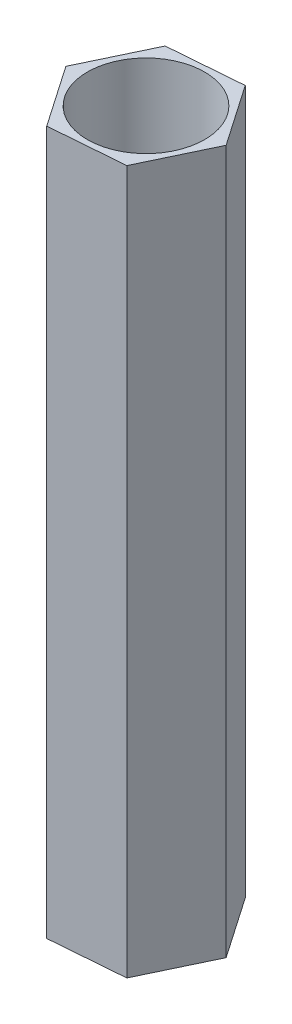
ISO-10303-21;
HEADER;
FILE_DESCRIPTION(('STEP AP214'),'2;1');
FILE_NAME('part.step','',(''),(''),'','','');
FILE_SCHEMA(('AUTOMOTIVE_DESIGN { 1 0 10303 214 1 1 1 1 }'));
ENDSEC;
DATA;
#1=APPLICATION_CONTEXT('core data for automotive mechanical design processes');
#2=APPLICATION_PROTOCOL_DEFINITION('international standard','automotive_design',2000,#1);
#3=PRODUCT_CONTEXT('',#1,'mechanical');
#4=PRODUCT('Part','Part','',(#3));
#5=PRODUCT_RELATED_PRODUCT_CATEGORY('part','',(#4));
#6=PRODUCT_DEFINITION_FORMATION('','',#4);
#7=PRODUCT_DEFINITION_CONTEXT('part definition',#1,'design');
#8=PRODUCT_DEFINITION('design','',#6,#7);
#9=PRODUCT_DEFINITION_SHAPE('','',#8);
#10=(LENGTH_UNIT() NAMED_UNIT(*) SI_UNIT(.MILLI.,.METRE.));
#11=(NAMED_UNIT(*) PLANE_ANGLE_UNIT() SI_UNIT($,.RADIAN.));
#12=(NAMED_UNIT(*) SI_UNIT($,.STERADIAN.) SOLID_ANGLE_UNIT());
#13=UNCERTAINTY_MEASURE_WITH_UNIT(LENGTH_MEASURE(1.E-05),#10,'distance_accuracy_value','');
#14=(GEOMETRIC_REPRESENTATION_CONTEXT(3) GLOBAL_UNCERTAINTY_ASSIGNED_CONTEXT((#13)) GLOBAL_UNIT_ASSIGNED_CONTEXT((#10,
#11,#12)) REPRESENTATION_CONTEXT('',''));
#15=CARTESIAN_POINT('',(0.,0.,0.));
#16=DIRECTION('',(0.,0.,1.));
#17=DIRECTION('',(1.,0.,0.));
#18=AXIS2_PLACEMENT_3D('',#15,#16,#17);
#19=CARTESIAN_POINT('',(0.,18.,0.));
#20=DIRECTION('',(0.,1.,0.));
#21=DIRECTION('',(0.,0.,1.));
#22=AXIS2_PLACEMENT_3D('',#19,#20,#21);
#23=PLANE('',#22);
#24=DIRECTION('',(0.996869686812316,0.,-0.0790621749935751));
#25=VECTOR('',#24,1.);
#26=CARTESIAN_POINT('',(-0.819193331606914,18.,1.7201518204655));
#27=LINE('',#26,#25);
#28=CARTESIAN_POINT('',(-0.819193331606914,18.,1.7201518204655));
#29=VERTEX_POINT('',#28);
#30=CARTESIAN_POINT('',(1.08009850908571,18.,1.56951814601515));
#31=VERTEX_POINT('',#30);
#32=EDGE_CURVE('E129',#29,#31,#27,.T.);
#33=ORIENTED_EDGE('',*,*,#32,.T.);
#34=DIRECTION('',(0.429964991383271,0.,-0.902845560538891));
#35=VECTOR('',#34,1.);
#36=CARTESIAN_POINT('',(1.08009850908571,18.,1.56951814601515));
#37=LINE('',#36,#35);
#38=CARTESIAN_POINT('',(1.89929184069263,18.,-0.150633674450351));
#39=VERTEX_POINT('',#38);
#40=EDGE_CURVE('E87',#31,#39,#37,.T.);
#41=ORIENTED_EDGE('',*,*,#40,.T.);
#42=DIRECTION('',(-0.566904695429045,0.,-0.823783385545315));
#43=VECTOR('',#42,1.);
#44=CARTESIAN_POINT('',(1.89929184069263,18.,-0.150633674450351));
#45=LINE('',#44,#43);
#46=CARTESIAN_POINT('',(0.819193331606914,18.,-1.7201518204655));
#47=VERTEX_POINT('',#46);
#48=EDGE_CURVE('E100',#39,#47,#45,.T.);
#49=ORIENTED_EDGE('',*,*,#48,.T.);
#50=DIRECTION('',(-0.996869686812316,0.,0.0790621749935752));
#51=VECTOR('',#50,1.);
#52=CARTESIAN_POINT('',(0.819193331606914,18.,-1.7201518204655));
#53=LINE('',#52,#51);
#54=CARTESIAN_POINT('',(-1.08009850908571,18.,-1.56951814601515));
#55=VERTEX_POINT('',#54);
#56=EDGE_CURVE('E94',#47,#55,#53,.T.);
#57=ORIENTED_EDGE('',*,*,#56,.T.);
#58=DIRECTION('',(-0.429964991383271,0.,0.902845560538891));
#59=VECTOR('',#58,1.);
#60=CARTESIAN_POINT('',(-1.08009850908571,18.,-1.56951814601515));
#61=LINE('',#60,#59);
#62=CARTESIAN_POINT('',(-1.89929184069263,18.,0.150633674450351));
#63=VERTEX_POINT('',#62);
#64=EDGE_CURVE('E98',#55,#63,#61,.T.);
#65=ORIENTED_EDGE('',*,*,#64,.T.);
#66=DIRECTION('',(0.566904695429045,0.,0.823783385545315));
#67=VECTOR('',#66,1.);
#68=CARTESIAN_POINT('',(-1.89929184069263,18.,0.150633674450351));
#69=LINE('',#68,#67);
#70=EDGE_CURVE('E50',#63,#29,#69,.T.);
#71=ORIENTED_EDGE('',*,*,#70,.T.);
#72=EDGE_LOOP('',(#33,#41,#49,#57,#65,#71));
#73=FACE_BOUND('',#72,.T.);
#74=CARTESIAN_POINT('',(0.,18.,0.));
#75=DIRECTION('',(0.,1.,0.));
#76=DIRECTION('',(0.,0.,1.));
#77=AXIS2_PLACEMENT_3D('',#74,#75,#76);
#78=CIRCLE('',#77,1.5);
#79=CARTESIAN_POINT('',(0.,18.,1.5));
#80=VERTEX_POINT('',#79);
#81=EDGE_CURVE('E122',#80,#80,#78,.T.);
#82=ORIENTED_EDGE('',*,*,#81,.F.);
#83=EDGE_LOOP('',(#82));
#84=FACE_BOUND('',#83,.T.);
#85=ADVANCED_FACE('F33',(#73,#84),#23,.T.);
#86=CARTESIAN_POINT('',(0.,0.,0.));
#87=DIRECTION('',(0.,1.,0.));
#88=DIRECTION('',(0.,0.,1.));
#89=AXIS2_PLACEMENT_3D('',#86,#87,#88);
#90=PLANE('',#89);
#91=DIRECTION('',(0.996869686812316,0.,-0.0790621749935751));
#92=VECTOR('',#91,1.);
#93=CARTESIAN_POINT('',(-0.819193331606914,0.,1.7201518204655));
#94=LINE('',#93,#92);
#95=CARTESIAN_POINT('',(-0.819193331606914,0.,1.7201518204655));
#96=VERTEX_POINT('',#95);
#97=CARTESIAN_POINT('',(1.08009850908571,0.,1.56951814601515));
#98=VERTEX_POINT('',#97);
#99=EDGE_CURVE('E118',#96,#98,#94,.T.);
#100=ORIENTED_EDGE('',*,*,#99,.F.);
#101=DIRECTION('',(0.566904695429045,0.,0.823783385545315));
#102=VECTOR('',#101,1.);
#103=CARTESIAN_POINT('',(-1.89929184069263,0.,0.150633674450351));
#104=LINE('',#103,#102);
#105=CARTESIAN_POINT('',(-1.89929184069263,0.,0.150633674450351));
#106=VERTEX_POINT('',#105);
#107=EDGE_CURVE('E79',#106,#96,#104,.T.);
#108=ORIENTED_EDGE('',*,*,#107,.F.);
#109=DIRECTION('',(-0.429964991383271,0.,0.902845560538891));
#110=VECTOR('',#109,1.);
#111=CARTESIAN_POINT('',(-1.08009850908571,0.,-1.56951814601515));
#112=LINE('',#111,#110);
#113=CARTESIAN_POINT('',(-1.08009850908571,0.,-1.56951814601515));
#114=VERTEX_POINT('',#113);
#115=EDGE_CURVE('E73',#114,#106,#112,.T.);
#116=ORIENTED_EDGE('',*,*,#115,.F.);
#117=DIRECTION('',(-0.996869686812316,0.,0.0790621749935752));
#118=VECTOR('',#117,1.);
#119=CARTESIAN_POINT('',(0.819193331606914,0.,-1.7201518204655));
#120=LINE('',#119,#118);
#121=CARTESIAN_POINT('',(0.819193331606914,0.,-1.7201518204655));
#122=VERTEX_POINT('',#121);
#123=EDGE_CURVE('E108',#122,#114,#120,.T.);
#124=ORIENTED_EDGE('',*,*,#123,.F.);
#125=DIRECTION('',(-0.566904695429045,0.,-0.823783385545315));
#126=VECTOR('',#125,1.);
#127=CARTESIAN_POINT('',(1.89929184069263,0.,-0.150633674450351));
#128=LINE('',#127,#126);
#129=CARTESIAN_POINT('',(1.89929184069263,0.,-0.150633674450351));
#130=VERTEX_POINT('',#129);
#131=EDGE_CURVE('E124',#130,#122,#128,.T.);
#132=ORIENTED_EDGE('',*,*,#131,.F.);
#133=DIRECTION('',(0.429964991383271,0.,-0.902845560538891));
#134=VECTOR('',#133,1.);
#135=CARTESIAN_POINT('',(1.08009850908571,0.,1.56951814601515));
#136=LINE('',#135,#134);
#137=EDGE_CURVE('E121',#98,#130,#136,.T.);
#138=ORIENTED_EDGE('',*,*,#137,.F.);
#139=EDGE_LOOP('',(#100,#108,#116,#124,#132,#138));
#140=FACE_BOUND('',#139,.T.);
#141=CARTESIAN_POINT('',(0.,0.,0.));
#142=DIRECTION('',(0.,1.,0.));
#143=DIRECTION('',(0.,0.,1.));
#144=AXIS2_PLACEMENT_3D('',#141,#142,#143);
#145=CIRCLE('',#144,1.5);
#146=CARTESIAN_POINT('',(0.,0.,1.5));
#147=VERTEX_POINT('',#146);
#148=EDGE_CURVE('E222',#147,#147,#145,.T.);
#149=ORIENTED_EDGE('',*,*,#148,.T.);
#150=EDGE_LOOP('',(#149));
#151=FACE_BOUND('',#150,.T.);
#152=ADVANCED_FACE('F138',(#140,#151),#90,.F.);
#153=CARTESIAN_POINT('',(-0.819193331606914,18.,1.7201518204655));
#154=DIRECTION('',(-0.0790621749935751,0.,-0.996869686812316));
#155=DIRECTION('',(-0.996869686812316,0.,0.0790621749935751));
#156=AXIS2_PLACEMENT_3D('',#153,#154,#155);
#157=PLANE('',#156);
#158=ORIENTED_EDGE('',*,*,#99,.T.);
#159=DIRECTION('',(0.,-1.,0.));
#160=VECTOR('',#159,1.);
#161=CARTESIAN_POINT('',(1.08009850908571,18.,1.56951814601515));
#162=LINE('',#161,#160);
#163=EDGE_CURVE('E11',#31,#98,#162,.T.);
#164=ORIENTED_EDGE('',*,*,#163,.F.);
#165=ORIENTED_EDGE('',*,*,#32,.F.);
#166=DIRECTION('',(0.,-1.,0.));
#167=VECTOR('',#166,1.);
#168=CARTESIAN_POINT('',(-0.819193331606914,18.,1.7201518204655));
#169=LINE('',#168,#167);
#170=EDGE_CURVE('E114',#29,#96,#169,.T.);
#171=ORIENTED_EDGE('',*,*,#170,.T.);
#172=EDGE_LOOP('',(#158,#164,#165,#171));
#173=FACE_BOUND('',#172,.T.);
#174=ADVANCED_FACE('F35',(#173),#157,.F.);
#175=CARTESIAN_POINT('',(1.08009850908571,18.,1.56951814601515));
#176=DIRECTION('',(-0.902845560538891,0.,-0.429964991383271));
#177=DIRECTION('',(-0.429964991383271,0.,0.902845560538891));
#178=AXIS2_PLACEMENT_3D('',#175,#176,#177);
#179=PLANE('',#178);
#180=ORIENTED_EDGE('',*,*,#137,.T.);
#181=DIRECTION('',(0.,-1.,0.));
#182=VECTOR('',#181,1.);
#183=CARTESIAN_POINT('',(1.89929184069263,18.,-0.150633674450351));
#184=LINE('',#183,#182);
#185=EDGE_CURVE('E42',#39,#130,#184,.T.);
#186=ORIENTED_EDGE('',*,*,#185,.F.);
#187=ORIENTED_EDGE('',*,*,#40,.F.);
#188=ORIENTED_EDGE('',*,*,#163,.T.);
#189=EDGE_LOOP('',(#180,#186,#187,#188));
#190=FACE_BOUND('',#189,.T.);
#191=ADVANCED_FACE('F163',(#190),#179,.F.);
#192=CARTESIAN_POINT('',(1.89929184069263,18.,-0.150633674450351));
#193=DIRECTION('',(-0.823783385545315,0.,0.566904695429045));
#194=DIRECTION('',(0.566904695429045,0.,0.823783385545315));
#195=AXIS2_PLACEMENT_3D('',#192,#193,#194);
#196=PLANE('',#195);
#197=ORIENTED_EDGE('',*,*,#131,.T.);
#198=DIRECTION('',(0.,-1.,0.));
#199=VECTOR('',#198,1.);
#200=CARTESIAN_POINT('',(0.819193331606914,18.,-1.7201518204655));
#201=LINE('',#200,#199);
#202=EDGE_CURVE('E109',#47,#122,#201,.T.);
#203=ORIENTED_EDGE('',*,*,#202,.F.);
#204=ORIENTED_EDGE('',*,*,#48,.F.);
#205=ORIENTED_EDGE('',*,*,#185,.T.);
#206=EDGE_LOOP('',(#197,#203,#204,#205));
#207=FACE_BOUND('',#206,.T.);
#208=ADVANCED_FACE('F135',(#207),#196,.F.);
#209=CARTESIAN_POINT('',(0.819193331606914,18.,-1.7201518204655));
#210=DIRECTION('',(0.0790621749935752,0.,0.996869686812316));
#211=DIRECTION('',(0.996869686812316,0.,-0.0790621749935752));
#212=AXIS2_PLACEMENT_3D('',#209,#210,#211);
#213=PLANE('',#212);
#214=ORIENTED_EDGE('',*,*,#123,.T.);
#215=DIRECTION('',(0.,-1.,0.));
#216=VECTOR('',#215,1.);
#217=CARTESIAN_POINT('',(-1.08009850908571,18.,-1.56951814601515));
#218=LINE('',#217,#216);
#219=EDGE_CURVE('E105',#55,#114,#218,.T.);
#220=ORIENTED_EDGE('',*,*,#219,.F.);
#221=ORIENTED_EDGE('',*,*,#56,.F.);
#222=ORIENTED_EDGE('',*,*,#202,.T.);
#223=EDGE_LOOP('',(#214,#220,#221,#222));
#224=FACE_BOUND('',#223,.T.);
#225=ADVANCED_FACE('F106',(#224),#213,.F.);
#226=CARTESIAN_POINT('',(-1.08009850908571,18.,-1.56951814601515));
#227=DIRECTION('',(0.902845560538891,0.,0.429964991383271));
#228=DIRECTION('',(0.429964991383271,0.,-0.902845560538891));
#229=AXIS2_PLACEMENT_3D('',#226,#227,#228);
#230=PLANE('',#229);
#231=ORIENTED_EDGE('',*,*,#115,.T.);
#232=DIRECTION('',(0.,-1.,0.));
#233=VECTOR('',#232,1.);
#234=CARTESIAN_POINT('',(-1.89929184069263,18.,0.150633674450351));
#235=LINE('',#234,#233);
#236=EDGE_CURVE('E110',#63,#106,#235,.T.);
#237=ORIENTED_EDGE('',*,*,#236,.F.);
#238=ORIENTED_EDGE('',*,*,#64,.F.);
#239=ORIENTED_EDGE('',*,*,#219,.T.);
#240=EDGE_LOOP('',(#231,#237,#238,#239));
#241=FACE_BOUND('',#240,.T.);
#242=ADVANCED_FACE('F112',(#241),#230,.F.);
#243=CARTESIAN_POINT('',(-1.89929184069263,18.,0.150633674450351));
#244=DIRECTION('',(0.823783385545315,0.,-0.566904695429045));
#245=DIRECTION('',(-0.566904695429045,0.,-0.823783385545315));
#246=AXIS2_PLACEMENT_3D('',#243,#244,#245);
#247=PLANE('',#246);
#248=ORIENTED_EDGE('',*,*,#107,.T.);
#249=ORIENTED_EDGE('',*,*,#170,.F.);
#250=ORIENTED_EDGE('',*,*,#70,.F.);
#251=ORIENTED_EDGE('',*,*,#236,.T.);
#252=EDGE_LOOP('',(#248,#249,#250,#251));
#253=FACE_BOUND('',#252,.T.);
#254=ADVANCED_FACE('F143',(#253),#247,.F.);
#255=CARTESIAN_POINT('',(0.,18.,0.));
#256=DIRECTION('',(0.,-1.,0.));
#257=DIRECTION('',(0.,0.,-1.));
#258=AXIS2_PLACEMENT_3D('',#255,#256,#257);
#259=CYLINDRICAL_SURFACE('',#258,1.5);
#260=ORIENTED_EDGE('',*,*,#81,.T.);
#261=EDGE_LOOP('',(#260));
#262=FACE_BOUND('',#261,.T.);
#263=ORIENTED_EDGE('',*,*,#148,.F.);
#264=EDGE_LOOP('',(#263));
#265=FACE_BOUND('',#264,.T.);
#266=ADVANCED_FACE('F145',(#262,#265),#259,.F.);
#267=CLOSED_SHELL('',(#85,#152,#174,#191,#208,#225,#242,#254,#266));
#268=MANIFOLD_SOLID_BREP('B2',#267);
#269=ADVANCED_BREP_SHAPE_REPRESENTATION('',(#18,#268),#14);
#270=SHAPE_DEFINITION_REPRESENTATION(#9,#269);
ENDSEC;
END-ISO-10303-21;
